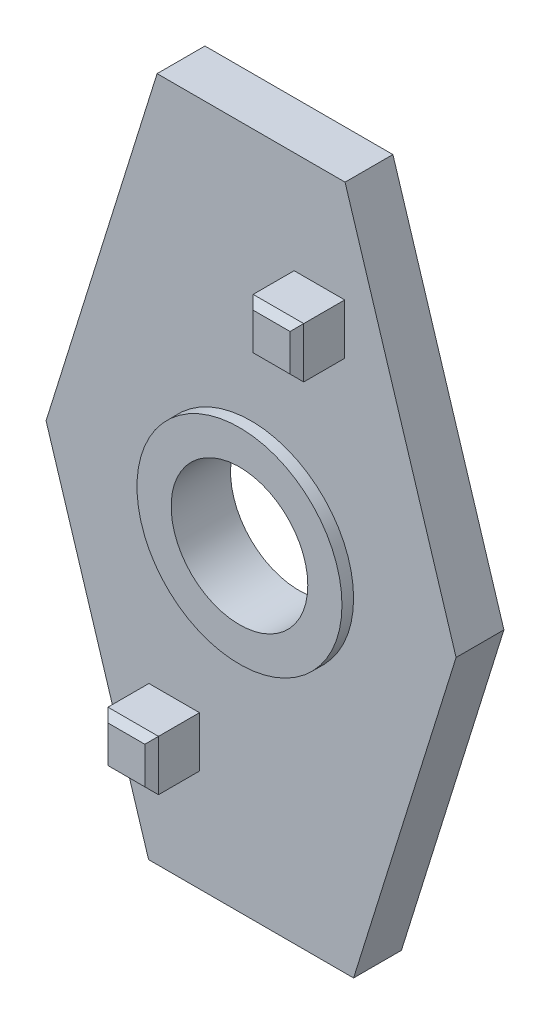
ISO-10303-21;
HEADER;
FILE_DESCRIPTION(('STEP AP214'),'2;1');
FILE_NAME('part.step','',(''),(''),'','','');
FILE_SCHEMA(('AUTOMOTIVE_DESIGN { 1 0 10303 214 1 1 1 1 }'));
ENDSEC;
DATA;
#1=APPLICATION_CONTEXT('core data for automotive mechanical design processes');
#2=APPLICATION_PROTOCOL_DEFINITION('international standard','automotive_design',2000,#1);
#3=PRODUCT_CONTEXT('',#1,'mechanical');
#4=PRODUCT('Part','Part','',(#3));
#5=PRODUCT_RELATED_PRODUCT_CATEGORY('part','',(#4));
#6=PRODUCT_DEFINITION_FORMATION('','',#4);
#7=PRODUCT_DEFINITION_CONTEXT('part definition',#1,'design');
#8=PRODUCT_DEFINITION('design','',#6,#7);
#9=PRODUCT_DEFINITION_SHAPE('','',#8);
#10=(LENGTH_UNIT() NAMED_UNIT(*) SI_UNIT(.MILLI.,.METRE.));
#11=(NAMED_UNIT(*) PLANE_ANGLE_UNIT() SI_UNIT($,.RADIAN.));
#12=(NAMED_UNIT(*) SI_UNIT($,.STERADIAN.) SOLID_ANGLE_UNIT());
#13=UNCERTAINTY_MEASURE_WITH_UNIT(LENGTH_MEASURE(1.E-05),#10,'distance_accuracy_value','');
#14=(GEOMETRIC_REPRESENTATION_CONTEXT(3) GLOBAL_UNCERTAINTY_ASSIGNED_CONTEXT((#13)) GLOBAL_UNIT_ASSIGNED_CONTEXT((#10,
#11,#12)) REPRESENTATION_CONTEXT('',''));
#15=CARTESIAN_POINT('',(0.,0.,0.));
#16=DIRECTION('',(0.,0.,1.));
#17=DIRECTION('',(1.,0.,0.));
#18=AXIS2_PLACEMENT_3D('',#15,#16,#17);
#19=CARTESIAN_POINT('',(0.,0.,0.));
#20=DIRECTION('',(0.,0.,1.));
#21=DIRECTION('',(1.,0.,0.));
#22=AXIS2_PLACEMENT_3D('',#19,#20,#21);
#23=PLANE('',#22);
#24=CARTESIAN_POINT('',(0.,0.,0.));
#25=DIRECTION('',(0.,0.,1.));
#26=DIRECTION('',(1.,0.,0.));
#27=AXIS2_PLACEMENT_3D('',#24,#25,#26);
#28=CIRCLE('',#27,15.);
#29=CARTESIAN_POINT('',(15.,0.,0.));
#30=VERTEX_POINT('',#29);
#31=EDGE_CURVE('E402',#30,#30,#28,.T.);
#32=ORIENTED_EDGE('',*,*,#31,.F.);
#33=EDGE_LOOP('',(#32));
#34=FACE_BOUND('',#33,.T.);
#35=DIRECTION('',(0.297606791710022,-0.954688534302192,0.));
#36=VECTOR('',#35,1.);
#37=CARTESIAN_POINT('',(27.342905925842,8.52365375328054,0.));
#38=LINE('',#37,#36);
#39=CARTESIAN_POINT('',(13.7530727309821,52.1182836327409,0.));
#40=VERTEX_POINT('',#39);
#41=CARTESIAN_POINT('',(30.,0.,0.));
#42=VERTEX_POINT('',#41);
#43=EDGE_CURVE('E216',#40,#42,#38,.T.);
#44=ORIENTED_EDGE('',*,*,#43,.F.);
#45=DIRECTION('',(1.,0.,0.));
#46=VECTOR('',#45,1.);
#47=CARTESIAN_POINT('',(0.,52.1182836327409,0.));
#48=LINE('',#47,#46);
#49=CARTESIAN_POINT('',(-13.7530727309821,52.1182836327409,0.));
#50=VERTEX_POINT('',#49);
#51=EDGE_CURVE('E275',#50,#40,#48,.T.);
#52=ORIENTED_EDGE('',*,*,#51,.F.);
#53=DIRECTION('',(0.297606791710022,0.954688534302192,0.));
#54=VECTOR('',#53,1.);
#55=CARTESIAN_POINT('',(-27.342905925842,8.52365375328056,0.));
#56=LINE('',#55,#54);
#57=CARTESIAN_POINT('',(-30.,0.,0.));
#58=VERTEX_POINT('',#57);
#59=EDGE_CURVE('E278',#58,#50,#56,.T.);
#60=ORIENTED_EDGE('',*,*,#59,.F.);
#61=DIRECTION('',(0.297606791710022,-0.954688534302192,0.));
#62=VECTOR('',#61,1.);
#63=CARTESIAN_POINT('',(-27.342905925842,-8.52365375328057,0.));
#64=LINE('',#63,#62);
#65=CARTESIAN_POINT('',(-15.,-48.1182836327409,0.));
#66=VERTEX_POINT('',#65);
#67=EDGE_CURVE('E281',#58,#66,#64,.T.);
#68=ORIENTED_EDGE('',*,*,#67,.T.);
#69=DIRECTION('',(1.,0.,0.));
#70=VECTOR('',#69,1.);
#71=CARTESIAN_POINT('',(0.,-48.1182836327409,0.));
#72=LINE('',#71,#70);
#73=CARTESIAN_POINT('',(15.,-48.1182836327409,0.));
#74=VERTEX_POINT('',#73);
#75=EDGE_CURVE('E285',#66,#74,#72,.T.);
#76=ORIENTED_EDGE('',*,*,#75,.T.);
#77=DIRECTION('',(0.297606791710022,0.954688534302192,0.));
#78=VECTOR('',#77,1.);
#79=CARTESIAN_POINT('',(27.342905925842,-8.52365375328056,0.));
#80=LINE('',#79,#78);
#81=EDGE_CURVE('E249',#74,#42,#80,.T.);
#82=ORIENTED_EDGE('',*,*,#81,.T.);
#83=EDGE_LOOP('',(#44,#52,#60,#68,#76,#82));
#84=FACE_BOUND('',#83,.T.);
#85=DIRECTION('',(0.,-1.,0.));
#86=VECTOR('',#85,1.);
#87=CARTESIAN_POINT('',(6.30307273098216,0.,0.));
#88=LINE('',#87,#86);
#89=CARTESIAN_POINT('',(6.30307273098216,37.1682836327409,0.));
#90=VERTEX_POINT('',#89);
#91=CARTESIAN_POINT('',(6.30307273098216,29.7682836327409,0.));
#92=VERTEX_POINT('',#91);
#93=EDGE_CURVE('E221',#90,#92,#88,.T.);
#94=ORIENTED_EDGE('',*,*,#93,.F.);
#95=DIRECTION('',(-1.,0.,0.));
#96=VECTOR('',#95,1.);
#97=CARTESIAN_POINT('',(0.,37.1682836327409,0.));
#98=LINE('',#97,#96);
#99=CARTESIAN_POINT('',(13.7030727309822,37.1682836327409,0.));
#100=VERTEX_POINT('',#99);
#101=EDGE_CURVE('E217',#100,#90,#98,.T.);
#102=ORIENTED_EDGE('',*,*,#101,.F.);
#103=DIRECTION('',(0.,-1.,0.));
#104=VECTOR('',#103,1.);
#105=CARTESIAN_POINT('',(13.7030727309822,0.,0.));
#106=LINE('',#105,#104);
#107=CARTESIAN_POINT('',(13.7030727309822,29.7682836327409,0.));
#108=VERTEX_POINT('',#107);
#109=EDGE_CURVE('E230',#100,#108,#106,.T.);
#110=ORIENTED_EDGE('',*,*,#109,.T.);
#111=DIRECTION('',(-1.,0.,0.));
#112=VECTOR('',#111,1.);
#113=CARTESIAN_POINT('',(0.,29.7682836327409,0.));
#114=LINE('',#113,#112);
#115=EDGE_CURVE('E226',#108,#92,#114,.T.);
#116=ORIENTED_EDGE('',*,*,#115,.T.);
#117=EDGE_LOOP('',(#94,#102,#110,#116));
#118=FACE_BOUND('',#117,.T.);
#119=DIRECTION('',(0.,1.,0.));
#120=VECTOR('',#119,1.);
#121=CARTESIAN_POINT('',(-7.54999999999999,0.,0.));
#122=LINE('',#121,#120);
#123=CARTESIAN_POINT('',(-7.54999999999999,-33.1682836327409,0.));
#124=VERTEX_POINT('',#123);
#125=CARTESIAN_POINT('',(-7.54999999999999,-25.7682836327409,0.));
#126=VERTEX_POINT('',#125);
#127=EDGE_CURVE('E196',#124,#126,#122,.T.);
#128=ORIENTED_EDGE('',*,*,#127,.F.);
#129=DIRECTION('',(1.,0.,0.));
#130=VECTOR('',#129,1.);
#131=CARTESIAN_POINT('',(0.,-33.1682836327409,0.));
#132=LINE('',#131,#130);
#133=CARTESIAN_POINT('',(-14.95,-33.1682836327409,0.));
#134=VERTEX_POINT('',#133);
#135=EDGE_CURVE('E180',#134,#124,#132,.T.);
#136=ORIENTED_EDGE('',*,*,#135,.F.);
#137=DIRECTION('',(0.,1.,0.));
#138=VECTOR('',#137,1.);
#139=CARTESIAN_POINT('',(-14.95,0.,0.));
#140=LINE('',#139,#138);
#141=CARTESIAN_POINT('',(-14.95,-25.7682836327409,0.));
#142=VERTEX_POINT('',#141);
#143=EDGE_CURVE('E188',#134,#142,#140,.T.);
#144=ORIENTED_EDGE('',*,*,#143,.T.);
#145=DIRECTION('',(1.,0.,0.));
#146=VECTOR('',#145,1.);
#147=CARTESIAN_POINT('',(0.,-25.7682836327409,0.));
#148=LINE('',#147,#146);
#149=EDGE_CURVE('E202',#142,#126,#148,.T.);
#150=ORIENTED_EDGE('',*,*,#149,.T.);
#151=EDGE_LOOP('',(#128,#136,#144,#150));
#152=FACE_BOUND('',#151,.T.);
#153=ADVANCED_FACE('F49',(#34,#84,#118,#152),#23,.T.);
#154=CARTESIAN_POINT('',(27.342905925842,8.52365375328054,-7.));
#155=DIRECTION('',(-0.954688534302192,-0.297606791710022,0.));
#156=DIRECTION('',(0.297606791710022,-0.954688534302192,0.));
#157=AXIS2_PLACEMENT_3D('',#154,#155,#156);
#158=PLANE('',#157);
#159=ORIENTED_EDGE('',*,*,#43,.T.);
#160=DIRECTION('',(0.,0.,1.));
#161=VECTOR('',#160,1.);
#162=CARTESIAN_POINT('',(30.,0.,-7.));
#163=LINE('',#162,#161);
#164=CARTESIAN_POINT('',(30.,0.,-7.));
#165=VERTEX_POINT('',#164);
#166=EDGE_CURVE('E292',#165,#42,#163,.T.);
#167=ORIENTED_EDGE('',*,*,#166,.F.);
#168=DIRECTION('',(0.297606791710022,-0.954688534302192,0.));
#169=VECTOR('',#168,1.);
#170=CARTESIAN_POINT('',(27.342905925842,8.52365375328054,-7.));
#171=LINE('',#170,#169);
#172=CARTESIAN_POINT('',(13.7530727309821,52.1182836327409,-7.));
#173=VERTEX_POINT('',#172);
#174=EDGE_CURVE('E245',#173,#165,#171,.T.);
#175=ORIENTED_EDGE('',*,*,#174,.F.);
#176=DIRECTION('',(0.,0.,1.));
#177=VECTOR('',#176,1.);
#178=CARTESIAN_POINT('',(13.7530727309821,52.1182836327409,-7.));
#179=LINE('',#178,#177);
#180=EDGE_CURVE('E271',#173,#40,#179,.T.);
#181=ORIENTED_EDGE('',*,*,#180,.T.);
#182=EDGE_LOOP('',(#159,#167,#175,#181));
#183=FACE_BOUND('',#182,.T.);
#184=ADVANCED_FACE('F430',(#183),#158,.F.);
#185=CARTESIAN_POINT('',(27.342905925842,-8.52365375328056,-7.));
#186=DIRECTION('',(0.954688534302192,-0.297606791710022,0.));
#187=DIRECTION('',(0.297606791710022,0.954688534302192,0.));
#188=AXIS2_PLACEMENT_3D('',#185,#186,#187);
#189=PLANE('',#188);
#190=ORIENTED_EDGE('',*,*,#81,.F.);
#191=DIRECTION('',(0.,0.,1.));
#192=VECTOR('',#191,1.);
#193=CARTESIAN_POINT('',(15.,-48.1182836327409,-7.));
#194=LINE('',#193,#192);
#195=CARTESIAN_POINT('',(15.,-48.1182836327409,-7.));
#196=VERTEX_POINT('',#195);
#197=EDGE_CURVE('E296',#196,#74,#194,.T.);
#198=ORIENTED_EDGE('',*,*,#197,.F.);
#199=DIRECTION('',(0.297606791710022,0.954688534302192,0.));
#200=VECTOR('',#199,1.);
#201=CARTESIAN_POINT('',(27.342905925842,-8.52365375328056,-7.));
#202=LINE('',#201,#200);
#203=EDGE_CURVE('E263',#196,#165,#202,.T.);
#204=ORIENTED_EDGE('',*,*,#203,.T.);
#205=ORIENTED_EDGE('',*,*,#166,.T.);
#206=EDGE_LOOP('',(#190,#198,#204,#205));
#207=FACE_BOUND('',#206,.T.);
#208=ADVANCED_FACE('F497',(#207),#189,.T.);
#209=CARTESIAN_POINT('',(0.,-48.1182836327409,-7.));
#210=DIRECTION('',(0.,-1.,0.));
#211=DIRECTION('',(1.,0.,0.));
#212=AXIS2_PLACEMENT_3D('',#209,#210,#211);
#213=PLANE('',#212);
#214=ORIENTED_EDGE('',*,*,#75,.F.);
#215=DIRECTION('',(0.,0.,1.));
#216=VECTOR('',#215,1.);
#217=CARTESIAN_POINT('',(-15.,-48.1182836327409,-7.));
#218=LINE('',#217,#216);
#219=CARTESIAN_POINT('',(-15.,-48.1182836327409,-7.));
#220=VERTEX_POINT('',#219);
#221=EDGE_CURVE('E299',#220,#66,#218,.T.);
#222=ORIENTED_EDGE('',*,*,#221,.F.);
#223=DIRECTION('',(1.,0.,0.));
#224=VECTOR('',#223,1.);
#225=CARTESIAN_POINT('',(0.,-48.1182836327409,-7.));
#226=LINE('',#225,#224);
#227=EDGE_CURVE('E259',#220,#196,#226,.T.);
#228=ORIENTED_EDGE('',*,*,#227,.T.);
#229=ORIENTED_EDGE('',*,*,#197,.T.);
#230=EDGE_LOOP('',(#214,#222,#228,#229));
#231=FACE_BOUND('',#230,.T.);
#232=ADVANCED_FACE('F500',(#231),#213,.T.);
#233=CARTESIAN_POINT('',(-27.342905925842,-8.52365375328057,-7.));
#234=DIRECTION('',(-0.954688534302192,-0.297606791710022,0.));
#235=DIRECTION('',(0.297606791710022,-0.954688534302192,0.));
#236=AXIS2_PLACEMENT_3D('',#233,#234,#235);
#237=PLANE('',#236);
#238=ORIENTED_EDGE('',*,*,#67,.F.);
#239=DIRECTION('',(0.,0.,1.));
#240=VECTOR('',#239,1.);
#241=CARTESIAN_POINT('',(-30.,0.,-7.));
#242=LINE('',#241,#240);
#243=CARTESIAN_POINT('',(-30.,0.,-7.));
#244=VERTEX_POINT('',#243);
#245=EDGE_CURVE('E302',#244,#58,#242,.T.);
#246=ORIENTED_EDGE('',*,*,#245,.F.);
#247=DIRECTION('',(0.297606791710022,-0.954688534302192,0.));
#248=VECTOR('',#247,1.);
#249=CARTESIAN_POINT('',(-27.342905925842,-8.52365375328057,-7.));
#250=LINE('',#249,#248);
#251=EDGE_CURVE('E255',#244,#220,#250,.T.);
#252=ORIENTED_EDGE('',*,*,#251,.T.);
#253=ORIENTED_EDGE('',*,*,#221,.T.);
#254=EDGE_LOOP('',(#238,#246,#252,#253));
#255=FACE_BOUND('',#254,.T.);
#256=ADVANCED_FACE('F504',(#255),#237,.T.);
#257=CARTESIAN_POINT('',(-27.342905925842,8.52365375328056,-7.));
#258=DIRECTION('',(0.954688534302192,-0.297606791710022,0.));
#259=DIRECTION('',(0.297606791710022,0.954688534302192,0.));
#260=AXIS2_PLACEMENT_3D('',#257,#258,#259);
#261=PLANE('',#260);
#262=ORIENTED_EDGE('',*,*,#59,.T.);
#263=DIRECTION('',(0.,0.,1.));
#264=VECTOR('',#263,1.);
#265=CARTESIAN_POINT('',(-13.7530727309821,52.1182836327409,-7.));
#266=LINE('',#265,#264);
#267=CARTESIAN_POINT('',(-13.7530727309821,52.1182836327409,-7.));
#268=VERTEX_POINT('',#267);
#269=EDGE_CURVE('E305',#268,#50,#266,.T.);
#270=ORIENTED_EDGE('',*,*,#269,.F.);
#271=DIRECTION('',(0.297606791710022,0.954688534302192,0.));
#272=VECTOR('',#271,1.);
#273=CARTESIAN_POINT('',(-27.342905925842,8.52365375328056,-7.));
#274=LINE('',#273,#272);
#275=EDGE_CURVE('E252',#244,#268,#274,.T.);
#276=ORIENTED_EDGE('',*,*,#275,.F.);
#277=ORIENTED_EDGE('',*,*,#245,.T.);
#278=EDGE_LOOP('',(#262,#270,#276,#277));
#279=FACE_BOUND('',#278,.T.);
#280=ADVANCED_FACE('F508',(#279),#261,.F.);
#281=CARTESIAN_POINT('',(0.,52.1182836327409,-7.));
#282=DIRECTION('',(0.,-1.,0.));
#283=DIRECTION('',(0.,0.,-1.));
#284=AXIS2_PLACEMENT_3D('',#281,#282,#283);
#285=PLANE('',#284);
#286=ORIENTED_EDGE('',*,*,#51,.T.);
#287=ORIENTED_EDGE('',*,*,#180,.F.);
#288=DIRECTION('',(1.,0.,0.));
#289=VECTOR('',#288,1.);
#290=CARTESIAN_POINT('',(0.,52.1182836327409,-7.));
#291=LINE('',#290,#289);
#292=EDGE_CURVE('E248',#268,#173,#291,.T.);
#293=ORIENTED_EDGE('',*,*,#292,.F.);
#294=ORIENTED_EDGE('',*,*,#269,.T.);
#295=EDGE_LOOP('',(#286,#287,#293,#294));
#296=FACE_BOUND('',#295,.T.);
#297=ADVANCED_FACE('F495',(#296),#285,.F.);
#298=CARTESIAN_POINT('',(0.,0.,-7.));
#299=DIRECTION('',(0.,0.,1.));
#300=DIRECTION('',(1.,0.,0.));
#301=AXIS2_PLACEMENT_3D('',#298,#299,#300);
#302=CYLINDRICAL_SURFACE('',#301,10.);
#303=CARTESIAN_POINT('',(0.,0.,-7.));
#304=DIRECTION('',(0.,0.,1.));
#305=DIRECTION('',(1.,0.,0.));
#306=AXIS2_PLACEMENT_3D('',#303,#304,#305);
#307=CIRCLE('',#306,10.);
#308=CARTESIAN_POINT('',(10.,0.,-7.));
#309=VERTEX_POINT('',#308);
#310=EDGE_CURVE('E267',#309,#309,#307,.T.);
#311=ORIENTED_EDGE('',*,*,#310,.F.);
#312=EDGE_LOOP('',(#311));
#313=FACE_BOUND('',#312,.T.);
#314=CARTESIAN_POINT('',(0.,0.,1.7));
#315=DIRECTION('',(0.,0.,1.));
#316=DIRECTION('',(1.,0.,0.));
#317=AXIS2_PLACEMENT_3D('',#314,#315,#316);
#318=CIRCLE('',#317,10.);
#319=CARTESIAN_POINT('',(10.,0.,1.7));
#320=VERTEX_POINT('',#319);
#321=EDGE_CURVE('E406',#320,#320,#318,.T.);
#322=ORIENTED_EDGE('',*,*,#321,.T.);
#323=EDGE_LOOP('',(#322));
#324=FACE_BOUND('',#323,.T.);
#325=ADVANCED_FACE('F414',(#313,#324),#302,.F.);
#326=CARTESIAN_POINT('',(0.,0.,-7.));
#327=DIRECTION('',(0.,0.,1.));
#328=DIRECTION('',(1.,0.,0.));
#329=AXIS2_PLACEMENT_3D('',#326,#327,#328);
#330=PLANE('',#329);
#331=ORIENTED_EDGE('',*,*,#174,.T.);
#332=ORIENTED_EDGE('',*,*,#203,.F.);
#333=ORIENTED_EDGE('',*,*,#227,.F.);
#334=ORIENTED_EDGE('',*,*,#251,.F.);
#335=ORIENTED_EDGE('',*,*,#275,.T.);
#336=ORIENTED_EDGE('',*,*,#292,.T.);
#337=EDGE_LOOP('',(#331,#332,#333,#334,#335,#336));
#338=FACE_BOUND('',#337,.T.);
#339=ORIENTED_EDGE('',*,*,#310,.T.);
#340=EDGE_LOOP('',(#339));
#341=FACE_BOUND('',#340,.T.);
#342=ADVANCED_FACE('F489',(#338,#341),#330,.F.);
#343=CARTESIAN_POINT('',(0.,37.1682836327409,7.));
#344=DIRECTION('',(0.,-1.,0.));
#345=DIRECTION('',(0.,0.,-1.));
#346=AXIS2_PLACEMENT_3D('',#343,#344,#345);
#347=PLANE('',#346);
#348=DIRECTION('',(0.,0.,-1.));
#349=VECTOR('',#348,1.);
#350=CARTESIAN_POINT('',(6.30307273098216,37.1682836327409,7.));
#351=LINE('',#350,#349);
#352=CARTESIAN_POINT('',(6.30307273098216,37.1682836327409,6.));
#353=VERTEX_POINT('',#352);
#354=EDGE_CURVE('E198',#353,#90,#351,.T.);
#355=ORIENTED_EDGE('',*,*,#354,.F.);
#356=DIRECTION('',(1.,0.,0.));
#357=VECTOR('',#356,1.);
#358=CARTESIAN_POINT('',(13.7030727309822,37.1682836327409,6.));
#359=LINE('',#358,#357);
#360=CARTESIAN_POINT('',(13.7030727309822,37.1682836327409,6.));
#361=VERTEX_POINT('',#360);
#362=EDGE_CURVE('E334',#353,#361,#359,.T.);
#363=ORIENTED_EDGE('',*,*,#362,.T.);
#364=DIRECTION('',(0.,0.,-1.));
#365=VECTOR('',#364,1.);
#366=CARTESIAN_POINT('',(13.7030727309822,37.1682836327409,7.));
#367=LINE('',#366,#365);
#368=EDGE_CURVE('E234',#361,#100,#367,.T.);
#369=ORIENTED_EDGE('',*,*,#368,.T.);
#370=ORIENTED_EDGE('',*,*,#101,.T.);
#371=EDGE_LOOP('',(#355,#363,#369,#370));
#372=FACE_BOUND('',#371,.T.);
#373=ADVANCED_FACE('F443',(#372),#347,.F.);
#374=CARTESIAN_POINT('',(6.30307273098216,0.,7.));
#375=DIRECTION('',(1.,0.,0.));
#376=DIRECTION('',(0.,0.,-1.));
#377=AXIS2_PLACEMENT_3D('',#374,#375,#376);
#378=PLANE('',#377);
#379=DIRECTION('',(0.,0.,-1.));
#380=VECTOR('',#379,1.);
#381=CARTESIAN_POINT('',(6.30307273098216,29.7682836327409,7.));
#382=LINE('',#381,#380);
#383=CARTESIAN_POINT('',(6.30307273098216,29.7682836327409,6.));
#384=VERTEX_POINT('',#383);
#385=EDGE_CURVE('E240',#384,#92,#382,.T.);
#386=ORIENTED_EDGE('',*,*,#385,.F.);
#387=DIRECTION('',(0.,1.,0.));
#388=VECTOR('',#387,1.);
#389=CARTESIAN_POINT('',(6.30307273098216,37.1682836327409,6.));
#390=LINE('',#389,#388);
#391=EDGE_CURVE('E331',#384,#353,#390,.T.);
#392=ORIENTED_EDGE('',*,*,#391,.T.);
#393=ORIENTED_EDGE('',*,*,#354,.T.);
#394=ORIENTED_EDGE('',*,*,#93,.T.);
#395=EDGE_LOOP('',(#386,#392,#393,#394));
#396=FACE_BOUND('',#395,.T.);
#397=ADVANCED_FACE('F467',(#396),#378,.F.);
#398=CARTESIAN_POINT('',(0.,29.7682836327409,7.));
#399=DIRECTION('',(0.,-1.,0.));
#400=DIRECTION('',(1.,0.,0.));
#401=AXIS2_PLACEMENT_3D('',#398,#399,#400);
#402=PLANE('',#401);
#403=DIRECTION('',(0.,0.,-1.));
#404=VECTOR('',#403,1.);
#405=CARTESIAN_POINT('',(13.7030727309822,29.7682836327409,7.));
#406=LINE('',#405,#404);
#407=CARTESIAN_POINT('',(13.7030727309822,29.7682836327409,6.));
#408=VERTEX_POINT('',#407);
#409=EDGE_CURVE('E237',#408,#108,#406,.T.);
#410=ORIENTED_EDGE('',*,*,#409,.F.);
#411=DIRECTION('',(-1.,0.,0.));
#412=VECTOR('',#411,1.);
#413=CARTESIAN_POINT('',(0.,29.7682836327409,6.));
#414=LINE('',#413,#412);
#415=EDGE_CURVE('E328',#408,#384,#414,.T.);
#416=ORIENTED_EDGE('',*,*,#415,.T.);
#417=ORIENTED_EDGE('',*,*,#385,.T.);
#418=ORIENTED_EDGE('',*,*,#115,.F.);
#419=EDGE_LOOP('',(#410,#416,#417,#418));
#420=FACE_BOUND('',#419,.T.);
#421=ADVANCED_FACE('F465',(#420),#402,.T.);
#422=CARTESIAN_POINT('',(13.7030727309822,0.,7.));
#423=DIRECTION('',(1.,0.,0.));
#424=DIRECTION('',(0.,0.,-1.));
#425=AXIS2_PLACEMENT_3D('',#422,#423,#424);
#426=PLANE('',#425);
#427=ORIENTED_EDGE('',*,*,#368,.F.);
#428=DIRECTION('',(0.,-1.,0.));
#429=VECTOR('',#428,1.);
#430=CARTESIAN_POINT('',(13.7030727309822,0.,6.));
#431=LINE('',#430,#429);
#432=EDGE_CURVE('E295',#361,#408,#431,.T.);
#433=ORIENTED_EDGE('',*,*,#432,.T.);
#434=ORIENTED_EDGE('',*,*,#409,.T.);
#435=ORIENTED_EDGE('',*,*,#109,.F.);
#436=EDGE_LOOP('',(#427,#433,#434,#435));
#437=FACE_BOUND('',#436,.T.);
#438=ADVANCED_FACE('F449',(#437),#426,.T.);
#439=CARTESIAN_POINT('',(0.,0.,7.));
#440=DIRECTION('',(0.,0.,1.));
#441=DIRECTION('',(1.,0.,0.));
#442=AXIS2_PLACEMENT_3D('',#439,#440,#441);
#443=PLANE('',#442);
#444=DIRECTION('',(1.,0.,0.));
#445=VECTOR('',#444,1.);
#446=CARTESIAN_POINT('',(0.,30.7682836327408,7.));
#447=LINE('',#446,#445);
#448=CARTESIAN_POINT('',(7.30307273098214,30.7682836327408,7.));
#449=VERTEX_POINT('',#448);
#450=CARTESIAN_POINT('',(12.7030727309822,30.7682836327408,7.));
#451=VERTEX_POINT('',#450);
#452=EDGE_CURVE('E321',#449,#451,#447,.T.);
#453=ORIENTED_EDGE('',*,*,#452,.T.);
#454=DIRECTION('',(0.,1.,0.));
#455=VECTOR('',#454,1.);
#456=CARTESIAN_POINT('',(12.7030727309822,0.,7.));
#457=LINE('',#456,#455);
#458=CARTESIAN_POINT('',(12.7030727309822,36.1682836327409,7.));
#459=VERTEX_POINT('',#458);
#460=EDGE_CURVE('E324',#451,#459,#457,.T.);
#461=ORIENTED_EDGE('',*,*,#460,.T.);
#462=DIRECTION('',(-1.,0.,0.));
#463=VECTOR('',#462,1.);
#464=CARTESIAN_POINT('',(6.30307273098216,36.1682836327409,7.));
#465=LINE('',#464,#463);
#466=CARTESIAN_POINT('',(7.30307273098214,36.1682836327409,7.));
#467=VERTEX_POINT('',#466);
#468=EDGE_CURVE('E315',#459,#467,#465,.T.);
#469=ORIENTED_EDGE('',*,*,#468,.T.);
#470=DIRECTION('',(0.,-1.,0.));
#471=VECTOR('',#470,1.);
#472=CARTESIAN_POINT('',(7.30307273098214,29.7682836327409,7.));
#473=LINE('',#472,#471);
#474=EDGE_CURVE('E318',#467,#449,#473,.T.);
#475=ORIENTED_EDGE('',*,*,#474,.T.);
#476=EDGE_LOOP('',(#453,#461,#469,#475));
#477=FACE_BOUND('',#476,.T.);
#478=ADVANCED_FACE('F472',(#477),#443,.T.);
#479=CARTESIAN_POINT('',(0.,-33.1682836327409,7.));
#480=DIRECTION('',(0.,1.,0.));
#481=DIRECTION('',(0.,0.,1.));
#482=AXIS2_PLACEMENT_3D('',#479,#480,#481);
#483=PLANE('',#482);
#484=DIRECTION('',(0.,0.,-1.));
#485=VECTOR('',#484,1.);
#486=CARTESIAN_POINT('',(-7.54999999999999,-33.1682836327409,7.));
#487=LINE('',#486,#485);
#488=CARTESIAN_POINT('',(-7.54999999999999,-33.1682836327409,6.));
#489=VERTEX_POINT('',#488);
#490=EDGE_CURVE('E213',#489,#124,#487,.T.);
#491=ORIENTED_EDGE('',*,*,#490,.F.);
#492=DIRECTION('',(-1.,0.,0.));
#493=VECTOR('',#492,1.);
#494=CARTESIAN_POINT('',(-14.95,-33.1682836327409,6.));
#495=LINE('',#494,#493);
#496=CARTESIAN_POINT('',(-14.95,-33.1682836327409,6.));
#497=VERTEX_POINT('',#496);
#498=EDGE_CURVE('E11',#489,#497,#495,.T.);
#499=ORIENTED_EDGE('',*,*,#498,.T.);
#500=DIRECTION('',(0.,0.,-1.));
#501=VECTOR('',#500,1.);
#502=CARTESIAN_POINT('',(-14.95,-33.1682836327409,7.));
#503=LINE('',#502,#501);
#504=EDGE_CURVE('E177',#497,#134,#503,.T.);
#505=ORIENTED_EDGE('',*,*,#504,.T.);
#506=ORIENTED_EDGE('',*,*,#135,.T.);
#507=EDGE_LOOP('',(#491,#499,#505,#506));
#508=FACE_BOUND('',#507,.T.);
#509=ADVANCED_FACE('F179',(#508),#483,.F.);
#510=CARTESIAN_POINT('',(-7.54999999999999,0.,7.));
#511=DIRECTION('',(-1.,0.,0.));
#512=DIRECTION('',(0.,0.,1.));
#513=AXIS2_PLACEMENT_3D('',#510,#511,#512);
#514=PLANE('',#513);
#515=DIRECTION('',(0.,0.,-1.));
#516=VECTOR('',#515,1.);
#517=CARTESIAN_POINT('',(-7.54999999999999,-25.7682836327409,7.));
#518=LINE('',#517,#516);
#519=CARTESIAN_POINT('',(-7.54999999999999,-25.7682836327409,6.));
#520=VERTEX_POINT('',#519);
#521=EDGE_CURVE('E210',#520,#126,#518,.T.);
#522=ORIENTED_EDGE('',*,*,#521,.F.);
#523=DIRECTION('',(0.,-1.,0.));
#524=VECTOR('',#523,1.);
#525=CARTESIAN_POINT('',(-7.54999999999999,-33.1682836327409,6.));
#526=LINE('',#525,#524);
#527=EDGE_CURVE('E60',#520,#489,#526,.T.);
#528=ORIENTED_EDGE('',*,*,#527,.T.);
#529=ORIENTED_EDGE('',*,*,#490,.T.);
#530=ORIENTED_EDGE('',*,*,#127,.T.);
#531=EDGE_LOOP('',(#522,#528,#529,#530));
#532=FACE_BOUND('',#531,.T.);
#533=ADVANCED_FACE('F399',(#532),#514,.F.);
#534=CARTESIAN_POINT('',(0.,-25.7682836327409,7.));
#535=DIRECTION('',(0.,1.,0.));
#536=DIRECTION('',(-1.,0.,0.));
#537=AXIS2_PLACEMENT_3D('',#534,#535,#536);
#538=PLANE('',#537);
#539=DIRECTION('',(0.,0.,-1.));
#540=VECTOR('',#539,1.);
#541=CARTESIAN_POINT('',(-14.95,-25.7682836327409,7.));
#542=LINE('',#541,#540);
#543=CARTESIAN_POINT('',(-14.95,-25.7682836327409,6.));
#544=VERTEX_POINT('',#543);
#545=EDGE_CURVE('E187',#544,#142,#542,.T.);
#546=ORIENTED_EDGE('',*,*,#545,.F.);
#547=DIRECTION('',(1.,0.,0.));
#548=VECTOR('',#547,1.);
#549=CARTESIAN_POINT('',(0.,-25.7682836327409,6.));
#550=LINE('',#549,#548);
#551=EDGE_CURVE('E75',#544,#520,#550,.T.);
#552=ORIENTED_EDGE('',*,*,#551,.T.);
#553=ORIENTED_EDGE('',*,*,#521,.T.);
#554=ORIENTED_EDGE('',*,*,#149,.F.);
#555=EDGE_LOOP('',(#546,#552,#553,#554));
#556=FACE_BOUND('',#555,.T.);
#557=ADVANCED_FACE('F398',(#556),#538,.T.);
#558=CARTESIAN_POINT('',(-14.95,0.,7.));
#559=DIRECTION('',(-1.,0.,0.));
#560=DIRECTION('',(0.,-1.,0.));
#561=AXIS2_PLACEMENT_3D('',#558,#559,#560);
#562=PLANE('',#561);
#563=ORIENTED_EDGE('',*,*,#504,.F.);
#564=DIRECTION('',(0.,1.,0.));
#565=VECTOR('',#564,1.);
#566=CARTESIAN_POINT('',(-14.95,0.,6.));
#567=LINE('',#566,#565);
#568=EDGE_CURVE('E337',#497,#544,#567,.T.);
#569=ORIENTED_EDGE('',*,*,#568,.T.);
#570=ORIENTED_EDGE('',*,*,#545,.T.);
#571=ORIENTED_EDGE('',*,*,#143,.F.);
#572=EDGE_LOOP('',(#563,#569,#570,#571));
#573=FACE_BOUND('',#572,.T.);
#574=ADVANCED_FACE('F200',(#573),#562,.T.);
#575=CARTESIAN_POINT('',(0.,0.,7.));
#576=DIRECTION('',(0.,0.,1.));
#577=DIRECTION('',(1.,0.,0.));
#578=AXIS2_PLACEMENT_3D('',#575,#576,#577);
#579=PLANE('',#578);
#580=DIRECTION('',(-1.,0.,0.));
#581=VECTOR('',#580,1.);
#582=CARTESIAN_POINT('',(0.,-26.7682836327409,7.));
#583=LINE('',#582,#581);
#584=CARTESIAN_POINT('',(-8.54999999999997,-26.7682836327408,7.));
#585=VERTEX_POINT('',#584);
#586=CARTESIAN_POINT('',(-13.95,-26.7682836327408,7.));
#587=VERTEX_POINT('',#586);
#588=EDGE_CURVE('E346',#585,#587,#583,.T.);
#589=ORIENTED_EDGE('',*,*,#588,.T.);
#590=DIRECTION('',(0.,-1.,0.));
#591=VECTOR('',#590,1.);
#592=CARTESIAN_POINT('',(-13.95,0.,7.));
#593=LINE('',#592,#591);
#594=CARTESIAN_POINT('',(-13.95,-32.1682836327409,7.));
#595=VERTEX_POINT('',#594);
#596=EDGE_CURVE('E349',#587,#595,#593,.T.);
#597=ORIENTED_EDGE('',*,*,#596,.T.);
#598=DIRECTION('',(1.,0.,0.));
#599=VECTOR('',#598,1.);
#600=CARTESIAN_POINT('',(-7.54999999999999,-32.1682836327409,7.));
#601=LINE('',#600,#599);
#602=CARTESIAN_POINT('',(-8.54999999999997,-32.1682836327409,7.));
#603=VERTEX_POINT('',#602);
#604=EDGE_CURVE('E340',#595,#603,#601,.T.);
#605=ORIENTED_EDGE('',*,*,#604,.T.);
#606=DIRECTION('',(0.,1.,0.));
#607=VECTOR('',#606,1.);
#608=CARTESIAN_POINT('',(-8.54999999999997,-25.7682836327409,7.));
#609=LINE('',#608,#607);
#610=EDGE_CURVE('E343',#603,#585,#609,.T.);
#611=ORIENTED_EDGE('',*,*,#610,.T.);
#612=EDGE_LOOP('',(#589,#597,#605,#611));
#613=FACE_BOUND('',#612,.T.);
#614=ADVANCED_FACE('F391',(#613),#579,.T.);
#615=CARTESIAN_POINT('',(7.30307273098214,0.,7.));
#616=DIRECTION('',(-0.707106781186552,0.,0.707106781186543));
#617=DIRECTION('',(0.,1.,0.));
#618=AXIS2_PLACEMENT_3D('',#615,#616,#617);
#619=PLANE('',#618);
#620=DIRECTION('',(-0.577350269189623,-0.577350269189623,-0.577350269189631));
#621=VECTOR('',#620,1.);
#622=CARTESIAN_POINT('',(-2.95302181326471,20.512189088494,-3.256094544247));
#623=LINE('',#622,#621);
#624=EDGE_CURVE('E363',#449,#384,#623,.T.);
#625=ORIENTED_EDGE('',*,*,#624,.F.);
#626=ORIENTED_EDGE('',*,*,#474,.F.);
#627=DIRECTION('',(0.577350269189623,-0.577350269189623,0.577350269189631));
#628=VECTOR('',#627,1.);
#629=CARTESIAN_POINT('',(4.86871515398812,38.6026412097349,4.56564242300594));
#630=LINE('',#629,#628);
#631=EDGE_CURVE('E222',#353,#467,#630,.T.);
#632=ORIENTED_EDGE('',*,*,#631,.F.);
#633=ORIENTED_EDGE('',*,*,#391,.F.);
#634=EDGE_LOOP('',(#625,#626,#632,#633));
#635=FACE_BOUND('',#634,.T.);
#636=ADVANCED_FACE('F469',(#635),#619,.T.);
#637=CARTESIAN_POINT('',(0.,36.1682836327409,7.));
#638=DIRECTION('',(0.,0.707106781186552,0.707106781186543));
#639=DIRECTION('',(1.,0.,0.));
#640=AXIS2_PLACEMENT_3D('',#637,#638,#639);
#641=PLANE('',#640);
#642=ORIENTED_EDGE('',*,*,#631,.T.);
#643=ORIENTED_EDGE('',*,*,#468,.F.);
#644=DIRECTION('',(-0.577350269189623,-0.577350269189623,0.577350269189631));
#645=VECTOR('',#644,1.);
#646=CARTESIAN_POINT('',(8.46871515398815,31.9339260557469,11.2343575769941));
#647=LINE('',#646,#645);
#648=EDGE_CURVE('E360',#361,#459,#647,.T.);
#649=ORIENTED_EDGE('',*,*,#648,.F.);
#650=ORIENTED_EDGE('',*,*,#362,.F.);
#651=EDGE_LOOP('',(#642,#643,#649,#650));
#652=FACE_BOUND('',#651,.T.);
#653=ADVANCED_FACE('F454',(#652),#641,.T.);
#654=CARTESIAN_POINT('',(0.,29.7682836327409,6.));
#655=DIRECTION('',(0.,0.707106781186552,-0.707106781186543));
#656=DIRECTION('',(-1.,0.,0.));
#657=AXIS2_PLACEMENT_3D('',#654,#655,#656);
#658=PLANE('',#657);
#659=ORIENTED_EDGE('',*,*,#624,.T.);
#660=ORIENTED_EDGE('',*,*,#415,.F.);
#661=DIRECTION('',(-0.577350269189623,0.577350269189623,0.577350269189631));
#662=VECTOR('',#661,1.);
#663=CARTESIAN_POINT('',(9.13538182065481,34.3359745430682,10.5676909103274));
#664=LINE('',#663,#662);
#665=EDGE_CURVE('E357',#451,#408,#664,.F.);
#666=ORIENTED_EDGE('',*,*,#665,.F.);
#667=ORIENTED_EDGE('',*,*,#452,.F.);
#668=EDGE_LOOP('',(#659,#660,#666,#667));
#669=FACE_BOUND('',#668,.T.);
#670=ADVANCED_FACE('F462',(#669),#658,.F.);
#671=CARTESIAN_POINT('',(13.7030727309822,0.,6.));
#672=DIRECTION('',(-0.707106781186552,0.,-0.707106781186543));
#673=DIRECTION('',(0.,-1.,0.));
#674=AXIS2_PLACEMENT_3D('',#671,#672,#673);
#675=PLANE('',#674);
#676=ORIENTED_EDGE('',*,*,#648,.T.);
#677=ORIENTED_EDGE('',*,*,#460,.F.);
#678=ORIENTED_EDGE('',*,*,#665,.T.);
#679=ORIENTED_EDGE('',*,*,#432,.F.);
#680=EDGE_LOOP('',(#676,#677,#678,#679));
#681=FACE_BOUND('',#680,.T.);
#682=ADVANCED_FACE('F457',(#681),#675,.F.);
#683=CARTESIAN_POINT('',(-8.54999999999997,0.,7.));
#684=DIRECTION('',(0.707106781186552,0.,0.707106781186543));
#685=DIRECTION('',(0.,-1.,0.));
#686=AXIS2_PLACEMENT_3D('',#683,#684,#685);
#687=PLANE('',#686);
#688=DIRECTION('',(0.577350269189624,0.577350269189622,-0.577350269189632));
#689=VECTOR('',#688,1.);
#690=CARTESIAN_POINT('',(0.372761210913545,-17.8455224218274,-1.92276121091364));
#691=LINE('',#690,#689);
#692=EDGE_CURVE('E376',#585,#520,#691,.T.);
#693=ORIENTED_EDGE('',*,*,#692,.F.);
#694=ORIENTED_EDGE('',*,*,#610,.F.);
#695=DIRECTION('',(-0.577350269189623,0.577350269189623,0.577350269189631));
#696=VECTOR('',#695,1.);
#697=CARTESIAN_POINT('',(-5.70000000000001,-35.0182836327408,4.15));
#698=LINE('',#697,#696);
#699=EDGE_CURVE('E54',#489,#603,#698,.T.);
#700=ORIENTED_EDGE('',*,*,#699,.F.);
#701=ORIENTED_EDGE('',*,*,#527,.F.);
#702=EDGE_LOOP('',(#693,#694,#700,#701));
#703=FACE_BOUND('',#702,.T.);
#704=ADVANCED_FACE('F52',(#703),#687,.T.);
#705=CARTESIAN_POINT('',(0.,-32.1682836327409,7.));
#706=DIRECTION('',(0.,-0.707106781186552,0.707106781186543));
#707=DIRECTION('',(-1.,0.,0.));
#708=AXIS2_PLACEMENT_3D('',#705,#706,#707);
#709=PLANE('',#708);
#710=ORIENTED_EDGE('',*,*,#699,.T.);
#711=ORIENTED_EDGE('',*,*,#604,.F.);
#712=DIRECTION('',(0.577350269189623,0.577350269189623,0.577350269189631));
#713=VECTOR('',#712,1.);
#714=CARTESIAN_POINT('',(-9.30000000000004,-27.5182836327409,11.65));
#715=LINE('',#714,#713);
#716=EDGE_CURVE('E373',#497,#595,#715,.T.);
#717=ORIENTED_EDGE('',*,*,#716,.F.);
#718=ORIENTED_EDGE('',*,*,#498,.F.);
#719=EDGE_LOOP('',(#710,#711,#717,#718));
#720=FACE_BOUND('',#719,.T.);
#721=ADVANCED_FACE('F387',(#720),#709,.T.);
#722=CARTESIAN_POINT('',(0.,-25.7682836327409,6.));
#723=DIRECTION('',(0.,-0.707106781186554,-0.707106781186541));
#724=DIRECTION('',(1.,0.,0.));
#725=AXIS2_PLACEMENT_3D('',#722,#723,#724);
#726=PLANE('',#725);
#727=ORIENTED_EDGE('',*,*,#692,.T.);
#728=ORIENTED_EDGE('',*,*,#551,.F.);
#729=DIRECTION('',(0.577350269189624,-0.577350269189622,0.577350269189632));
#730=VECTOR('',#729,1.);
#731=CARTESIAN_POINT('',(-9.9666666666667,-30.7516169660741,10.9833333333334));
#732=LINE('',#731,#730);
#733=EDGE_CURVE('E370',#587,#544,#732,.F.);
#734=ORIENTED_EDGE('',*,*,#733,.F.);
#735=ORIENTED_EDGE('',*,*,#588,.F.);
#736=EDGE_LOOP('',(#727,#728,#734,#735));
#737=FACE_BOUND('',#736,.T.);
#738=ADVANCED_FACE('F397',(#737),#726,.F.);
#739=CARTESIAN_POINT('',(-14.95,0.,6.));
#740=DIRECTION('',(0.707106781186552,0.,-0.707106781186543));
#741=DIRECTION('',(0.,1.,0.));
#742=AXIS2_PLACEMENT_3D('',#739,#740,#741);
#743=PLANE('',#742);
#744=ORIENTED_EDGE('',*,*,#716,.T.);
#745=ORIENTED_EDGE('',*,*,#596,.F.);
#746=ORIENTED_EDGE('',*,*,#733,.T.);
#747=ORIENTED_EDGE('',*,*,#568,.F.);
#748=EDGE_LOOP('',(#744,#745,#746,#747));
#749=FACE_BOUND('',#748,.T.);
#750=ADVANCED_FACE('F395',(#749),#743,.F.);
#751=CARTESIAN_POINT('',(0.,0.,1.7));
#752=DIRECTION('',(0.,0.,-1.));
#753=DIRECTION('',(-1.,0.,0.));
#754=AXIS2_PLACEMENT_3D('',#751,#752,#753);
#755=CYLINDRICAL_SURFACE('',#754,15.);
#756=CARTESIAN_POINT('',(0.,0.,1.7));
#757=DIRECTION('',(0.,0.,1.));
#758=DIRECTION('',(1.,0.,0.));
#759=AXIS2_PLACEMENT_3D('',#756,#757,#758);
#760=CIRCLE('',#759,15.);
#761=CARTESIAN_POINT('',(15.,0.,1.7));
#762=VERTEX_POINT('',#761);
#763=EDGE_CURVE('E374',#762,#762,#760,.T.);
#764=ORIENTED_EDGE('',*,*,#763,.F.);
#765=EDGE_LOOP('',(#764));
#766=FACE_BOUND('',#765,.T.);
#767=ORIENTED_EDGE('',*,*,#31,.T.);
#768=EDGE_LOOP('',(#767));
#769=FACE_BOUND('',#768,.T.);
#770=ADVANCED_FACE('F419',(#766,#769),#755,.T.);
#771=CARTESIAN_POINT('',(0.,0.,1.7));
#772=DIRECTION('',(0.,0.,1.));
#773=DIRECTION('',(1.,0.,0.));
#774=AXIS2_PLACEMENT_3D('',#771,#772,#773);
#775=PLANE('',#774);
#776=ORIENTED_EDGE('',*,*,#321,.F.);
#777=EDGE_LOOP('',(#776));
#778=FACE_BOUND('',#777,.T.);
#779=ORIENTED_EDGE('',*,*,#763,.T.);
#780=EDGE_LOOP('',(#779));
#781=FACE_BOUND('',#780,.T.);
#782=ADVANCED_FACE('F416',(#778,#781),#775,.T.);
#783=CLOSED_SHELL('',(#153,#184,#208,#232,#256,#280,#297,#325,#342,#373,#397,#421,#438,#478,
#509,#533,#557,#574,#614,#636,#653,#670,#682,#704,#721,#738,#750,#770,#782));
#784=MANIFOLD_SOLID_BREP('B2',#783);
#785=ADVANCED_BREP_SHAPE_REPRESENTATION('',(#18,#784),#14);
#786=SHAPE_DEFINITION_REPRESENTATION(#9,#785);
ENDSEC;
END-ISO-10303-21;
